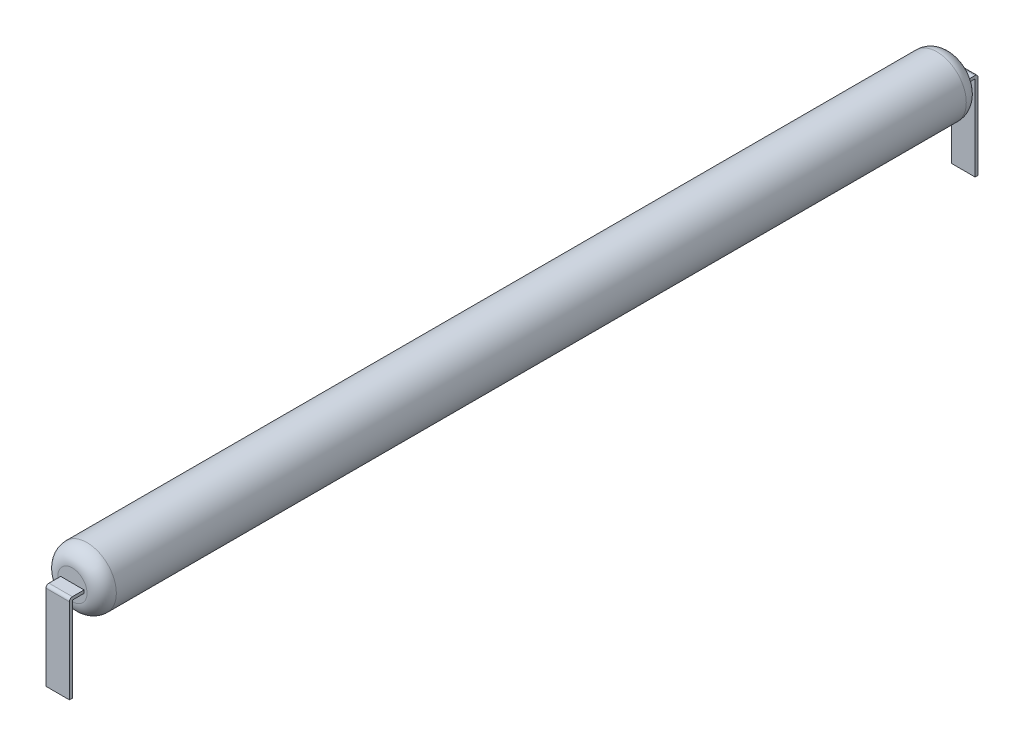
ISO-10303-21;
HEADER;
FILE_DESCRIPTION(('STEP AP214'),'2;1');
FILE_NAME('part.step','',(''),(''),'','','');
FILE_SCHEMA(('AUTOMOTIVE_DESIGN { 1 0 10303 214 1 1 1 1 }'));
ENDSEC;
DATA;
#1=APPLICATION_CONTEXT('core data for automotive mechanical design processes');
#2=APPLICATION_PROTOCOL_DEFINITION('international standard','automotive_design',2000,#1);
#3=PRODUCT_CONTEXT('',#1,'mechanical');
#4=PRODUCT('Part','Part','',(#3));
#5=PRODUCT_RELATED_PRODUCT_CATEGORY('part','',(#4));
#6=PRODUCT_DEFINITION_FORMATION('','',#4);
#7=PRODUCT_DEFINITION_CONTEXT('part definition',#1,'design');
#8=PRODUCT_DEFINITION('design','',#6,#7);
#9=PRODUCT_DEFINITION_SHAPE('','',#8);
#10=(LENGTH_UNIT() NAMED_UNIT(*) SI_UNIT(.MILLI.,.METRE.));
#11=(NAMED_UNIT(*) PLANE_ANGLE_UNIT() SI_UNIT($,.RADIAN.));
#12=(NAMED_UNIT(*) SI_UNIT($,.STERADIAN.) SOLID_ANGLE_UNIT());
#13=UNCERTAINTY_MEASURE_WITH_UNIT(LENGTH_MEASURE(1.E-05),#10,'distance_accuracy_value','');
#14=(GEOMETRIC_REPRESENTATION_CONTEXT(3) GLOBAL_UNCERTAINTY_ASSIGNED_CONTEXT((#13)) GLOBAL_UNIT_ASSIGNED_CONTEXT((#10,
#11,#12)) REPRESENTATION_CONTEXT('',''));
#15=CARTESIAN_POINT('',(0.,0.,0.));
#16=DIRECTION('',(0.,0.,1.));
#17=DIRECTION('',(1.,0.,0.));
#18=AXIS2_PLACEMENT_3D('',#15,#16,#17);
#19=CARTESIAN_POINT('',(0.4,-0.05,-16.));
#20=DIRECTION('',(0.,1.,0.));
#21=DIRECTION('',(0.,0.,1.));
#22=AXIS2_PLACEMENT_3D('',#19,#20,#21);
#23=PLANE('',#22);
#24=DIRECTION('',(0.,0.,1.));
#25=VECTOR('',#24,1.);
#26=CARTESIAN_POINT('',(-0.4,-0.05,-16.));
#27=LINE('',#26,#25);
#28=CARTESIAN_POINT('',(-0.4,-0.05,-15.4));
#29=VERTEX_POINT('',#28);
#30=CARTESIAN_POINT('',(-0.4,-0.05,-15.));
#31=VERTEX_POINT('',#30);
#32=EDGE_CURVE('E252',#29,#31,#27,.T.);
#33=ORIENTED_EDGE('',*,*,#32,.F.);
#34=DIRECTION('',(1.,0.,0.));
#35=VECTOR('',#34,1.);
#36=CARTESIAN_POINT('',(0.4,-0.05,-15.4));
#37=LINE('',#36,#35);
#38=CARTESIAN_POINT('',(0.4,-0.0500000000000001,-15.4));
#39=VERTEX_POINT('',#38);
#40=EDGE_CURVE('E308',#29,#39,#37,.T.);
#41=ORIENTED_EDGE('',*,*,#40,.T.);
#42=DIRECTION('',(0.,0.,1.));
#43=VECTOR('',#42,1.);
#44=CARTESIAN_POINT('',(0.4,-0.05,-16.));
#45=LINE('',#44,#43);
#46=CARTESIAN_POINT('',(0.4,-0.05,-15.));
#47=VERTEX_POINT('',#46);
#48=EDGE_CURVE('E255',#39,#47,#45,.T.);
#49=ORIENTED_EDGE('',*,*,#48,.T.);
#50=DIRECTION('',(-1.,0.,0.));
#51=VECTOR('',#50,1.);
#52=CARTESIAN_POINT('',(0.4,-0.05,-15.));
#53=LINE('',#52,#51);
#54=EDGE_CURVE('E248',#47,#31,#53,.T.);
#55=ORIENTED_EDGE('',*,*,#54,.T.);
#56=EDGE_LOOP('',(#33,#41,#49,#55));
#57=FACE_BOUND('',#56,.T.);
#58=ADVANCED_FACE('F40',(#57),#23,.F.);
#59=CARTESIAN_POINT('',(0.,0.,-15.));
#60=DIRECTION('',(0.,0.,1.));
#61=DIRECTION('',(1.,0.,0.));
#62=AXIS2_PLACEMENT_3D('',#59,#60,#61);
#63=PLANE('',#62);
#64=CARTESIAN_POINT('',(0.,0.,-15.));
#65=DIRECTION('',(0.,0.,1.));
#66=DIRECTION('',(1.,0.,0.));
#67=AXIS2_PLACEMENT_3D('',#64,#65,#66);
#68=CIRCLE('',#67,0.5);
#69=CARTESIAN_POINT('',(0.5,0.,-15.));
#70=VERTEX_POINT('',#69);
#71=EDGE_CURVE('E304',#70,#70,#68,.F.);
#72=ORIENTED_EDGE('',*,*,#71,.T.);
#73=EDGE_LOOP('',(#72));
#74=FACE_BOUND('',#73,.T.);
#75=DIRECTION('',(0.,1.,0.));
#76=VECTOR('',#75,1.);
#77=CARTESIAN_POINT('',(-0.4,-0.05,-15.));
#78=LINE('',#77,#76);
#79=CARTESIAN_POINT('',(-0.4,0.05,-15.));
#80=VERTEX_POINT('',#79);
#81=EDGE_CURVE('E233',#31,#80,#78,.T.);
#82=ORIENTED_EDGE('',*,*,#81,.F.);
#83=ORIENTED_EDGE('',*,*,#54,.F.);
#84=DIRECTION('',(0.,-1.,0.));
#85=VECTOR('',#84,1.);
#86=CARTESIAN_POINT('',(0.4,-0.05,-15.));
#87=LINE('',#86,#85);
#88=CARTESIAN_POINT('',(0.4,0.05,-15.));
#89=VERTEX_POINT('',#88);
#90=EDGE_CURVE('E244',#89,#47,#87,.T.);
#91=ORIENTED_EDGE('',*,*,#90,.F.);
#92=DIRECTION('',(1.,0.,0.));
#93=VECTOR('',#92,1.);
#94=CARTESIAN_POINT('',(0.4,0.05,-15.));
#95=LINE('',#94,#93);
#96=EDGE_CURVE('E240',#80,#89,#95,.T.);
#97=ORIENTED_EDGE('',*,*,#96,.F.);
#98=EDGE_LOOP('',(#82,#83,#91,#97));
#99=FACE_BOUND('',#98,.T.);
#100=ADVANCED_FACE('F355',(#74,#99),#63,.F.);
#101=CARTESIAN_POINT('',(0.,0.,15.));
#102=DIRECTION('',(0.,0.,1.));
#103=DIRECTION('',(1.,0.,0.));
#104=AXIS2_PLACEMENT_3D('',#101,#102,#103);
#105=PLANE('',#104);
#106=CARTESIAN_POINT('',(0.,0.,15.));
#107=DIRECTION('',(0.,0.,1.));
#108=DIRECTION('',(1.,0.,0.));
#109=AXIS2_PLACEMENT_3D('',#106,#107,#108);
#110=CIRCLE('',#109,0.5);
#111=CARTESIAN_POINT('',(0.5,0.,15.));
#112=VERTEX_POINT('',#111);
#113=EDGE_CURVE('E292',#112,#112,#110,.T.);
#114=ORIENTED_EDGE('',*,*,#113,.T.);
#115=EDGE_LOOP('',(#114));
#116=FACE_BOUND('',#115,.T.);
#117=DIRECTION('',(-1.,0.,0.));
#118=VECTOR('',#117,1.);
#119=CARTESIAN_POINT('',(-0.4,0.05,15.));
#120=LINE('',#119,#118);
#121=CARTESIAN_POINT('',(0.4,0.05,15.));
#122=VERTEX_POINT('',#121);
#123=CARTESIAN_POINT('',(-0.4,0.05,15.));
#124=VERTEX_POINT('',#123);
#125=EDGE_CURVE('E268',#122,#124,#120,.T.);
#126=ORIENTED_EDGE('',*,*,#125,.F.);
#127=DIRECTION('',(0.,1.,0.));
#128=VECTOR('',#127,1.);
#129=CARTESIAN_POINT('',(0.4,-0.05,15.));
#130=LINE('',#129,#128);
#131=CARTESIAN_POINT('',(0.4,-0.05,15.));
#132=VERTEX_POINT('',#131);
#133=EDGE_CURVE('E264',#132,#122,#130,.T.);
#134=ORIENTED_EDGE('',*,*,#133,.F.);
#135=DIRECTION('',(1.,0.,0.));
#136=VECTOR('',#135,1.);
#137=CARTESIAN_POINT('',(-0.4,-0.05,15.));
#138=LINE('',#137,#136);
#139=CARTESIAN_POINT('',(-0.4,-0.05,15.));
#140=VERTEX_POINT('',#139);
#141=EDGE_CURVE('E276',#140,#132,#138,.T.);
#142=ORIENTED_EDGE('',*,*,#141,.F.);
#143=DIRECTION('',(0.,-1.,0.));
#144=VECTOR('',#143,1.);
#145=CARTESIAN_POINT('',(-0.4,-0.05,15.));
#146=LINE('',#145,#144);
#147=EDGE_CURVE('E272',#124,#140,#146,.T.);
#148=ORIENTED_EDGE('',*,*,#147,.F.);
#149=EDGE_LOOP('',(#126,#134,#142,#148));
#150=FACE_BOUND('',#149,.T.);
#151=ADVANCED_FACE('F347',(#116,#150),#105,.T.);
#152=CARTESIAN_POINT('',(0.,0.,-15.));
#153=DIRECTION('',(0.,0.,1.));
#154=DIRECTION('',(1.,0.,0.));
#155=AXIS2_PLACEMENT_3D('',#152,#153,#154);
#156=CYLINDRICAL_SURFACE('',#155,1.);
#157=CARTESIAN_POINT('',(0.,0.,14.5));
#158=DIRECTION('',(0.,0.,1.));
#159=DIRECTION('',(1.,0.,0.));
#160=AXIS2_PLACEMENT_3D('',#157,#158,#159);
#161=CIRCLE('',#160,1.);
#162=CARTESIAN_POINT('',(1.,0.,14.5));
#163=VERTEX_POINT('',#162);
#164=EDGE_CURVE('E300',#163,#163,#161,.F.);
#165=ORIENTED_EDGE('',*,*,#164,.T.);
#166=EDGE_LOOP('',(#165));
#167=FACE_BOUND('',#166,.T.);
#168=CARTESIAN_POINT('',(0.,0.,-14.5));
#169=DIRECTION('',(0.,0.,1.));
#170=DIRECTION('',(1.,0.,0.));
#171=AXIS2_PLACEMENT_3D('',#168,#169,#170);
#172=CIRCLE('',#171,1.);
#173=CARTESIAN_POINT('',(1.,0.,-14.5));
#174=VERTEX_POINT('',#173);
#175=EDGE_CURVE('E296',#174,#174,#172,.T.);
#176=ORIENTED_EDGE('',*,*,#175,.T.);
#177=EDGE_LOOP('',(#176));
#178=FACE_BOUND('',#177,.T.);
#179=ADVANCED_FACE('F389',(#167,#178),#156,.T.);
#180=CARTESIAN_POINT('',(0.4,-0.05,16.));
#181=DIRECTION('',(-1.,0.,0.));
#182=DIRECTION('',(0.,0.,1.));
#183=AXIS2_PLACEMENT_3D('',#180,#181,#182);
#184=PLANE('',#183);
#185=DIRECTION('',(0.,0.,-1.));
#186=VECTOR('',#185,1.);
#187=CARTESIAN_POINT('',(0.4,0.05,16.));
#188=LINE('',#187,#186);
#189=CARTESIAN_POINT('',(0.4,0.05,15.4));
#190=VERTEX_POINT('',#189);
#191=EDGE_CURVE('E289',#190,#122,#188,.T.);
#192=ORIENTED_EDGE('',*,*,#191,.F.);
#193=CARTESIAN_POINT('',(0.4,-0.0500000000000001,15.4));
#194=DIRECTION('',(-1.,0.,0.));
#195=DIRECTION('',(0.,0.,1.));
#196=AXIS2_PLACEMENT_3D('',#193,#194,#195);
#197=CIRCLE('',#196,0.1);
#198=CARTESIAN_POINT('',(0.4,-0.0500000000000001,15.5));
#199=VERTEX_POINT('',#198);
#200=EDGE_CURVE('E11',#190,#199,#197,.F.);
#201=ORIENTED_EDGE('',*,*,#200,.T.);
#202=DIRECTION('',(0.,1.,0.));
#203=VECTOR('',#202,1.);
#204=CARTESIAN_POINT('',(0.4,-2.95,15.5));
#205=LINE('',#204,#203);
#206=CARTESIAN_POINT('',(0.4,-2.95,15.5));
#207=VERTEX_POINT('',#206);
#208=EDGE_CURVE('E191',#207,#199,#205,.T.);
#209=ORIENTED_EDGE('',*,*,#208,.F.);
#210=DIRECTION('',(0.,0.,1.));
#211=VECTOR('',#210,1.);
#212=CARTESIAN_POINT('',(0.4,-2.95,15.5));
#213=LINE('',#212,#211);
#214=CARTESIAN_POINT('',(0.4,-2.95,15.4));
#215=VERTEX_POINT('',#214);
#216=EDGE_CURVE('E180',#215,#207,#213,.T.);
#217=ORIENTED_EDGE('',*,*,#216,.F.);
#218=DIRECTION('',(0.,-1.,0.));
#219=VECTOR('',#218,1.);
#220=CARTESIAN_POINT('',(0.4,-2.95,15.4));
#221=LINE('',#220,#219);
#222=CARTESIAN_POINT('',(0.4,-0.05,15.4));
#223=VERTEX_POINT('',#222);
#224=EDGE_CURVE('E169',#223,#215,#221,.T.);
#225=ORIENTED_EDGE('',*,*,#224,.F.);
#226=DIRECTION('',(0.,0.,-1.));
#227=VECTOR('',#226,1.);
#228=CARTESIAN_POINT('',(0.4,-0.05,16.));
#229=LINE('',#228,#227);
#230=EDGE_CURVE('E280',#223,#132,#229,.T.);
#231=ORIENTED_EDGE('',*,*,#230,.T.);
#232=ORIENTED_EDGE('',*,*,#133,.T.);
#233=EDGE_LOOP('',(#192,#201,#209,#217,#225,#231,#232));
#234=FACE_BOUND('',#233,.T.);
#235=ADVANCED_FACE('F193',(#234),#184,.F.);
#236=CARTESIAN_POINT('',(-0.4,0.05,16.));
#237=DIRECTION('',(0.,-1.,0.));
#238=DIRECTION('',(0.,0.,-1.));
#239=AXIS2_PLACEMENT_3D('',#236,#237,#238);
#240=PLANE('',#239);
#241=DIRECTION('',(0.,0.,-1.));
#242=VECTOR('',#241,1.);
#243=CARTESIAN_POINT('',(-0.4,0.05,16.));
#244=LINE('',#243,#242);
#245=CARTESIAN_POINT('',(-0.4,0.05,15.4));
#246=VERTEX_POINT('',#245);
#247=EDGE_CURVE('E286',#246,#124,#244,.T.);
#248=ORIENTED_EDGE('',*,*,#247,.F.);
#249=DIRECTION('',(-1.,0.,0.));
#250=VECTOR('',#249,1.);
#251=CARTESIAN_POINT('',(0.4,0.05,15.4));
#252=LINE('',#251,#250);
#253=EDGE_CURVE('E49',#246,#190,#252,.F.);
#254=ORIENTED_EDGE('',*,*,#253,.T.);
#255=ORIENTED_EDGE('',*,*,#191,.T.);
#256=ORIENTED_EDGE('',*,*,#125,.T.);
#257=EDGE_LOOP('',(#248,#254,#255,#256));
#258=FACE_BOUND('',#257,.T.);
#259=ADVANCED_FACE('F348',(#258),#240,.F.);
#260=CARTESIAN_POINT('',(-0.4,-0.05,16.));
#261=DIRECTION('',(1.,0.,0.));
#262=DIRECTION('',(0.,0.,-1.));
#263=AXIS2_PLACEMENT_3D('',#260,#261,#262);
#264=PLANE('',#263);
#265=DIRECTION('',(0.,1.,0.));
#266=VECTOR('',#265,1.);
#267=CARTESIAN_POINT('',(-0.4,-2.95,15.5));
#268=LINE('',#267,#266);
#269=CARTESIAN_POINT('',(-0.4,-2.95,15.5));
#270=VERTEX_POINT('',#269);
#271=CARTESIAN_POINT('',(-0.4,-0.0500000000000001,15.5));
#272=VERTEX_POINT('',#271);
#273=EDGE_CURVE('E181',#270,#272,#268,.T.);
#274=ORIENTED_EDGE('',*,*,#273,.T.);
#275=CARTESIAN_POINT('',(-0.4,-0.0500000000000001,15.4));
#276=DIRECTION('',(1.,0.,0.));
#277=DIRECTION('',(0.,0.,-1.));
#278=AXIS2_PLACEMENT_3D('',#275,#276,#277);
#279=CIRCLE('',#278,0.1);
#280=EDGE_CURVE('E69',#272,#246,#279,.F.);
#281=ORIENTED_EDGE('',*,*,#280,.T.);
#282=ORIENTED_EDGE('',*,*,#247,.T.);
#283=ORIENTED_EDGE('',*,*,#147,.T.);
#284=DIRECTION('',(0.,0.,-1.));
#285=VECTOR('',#284,1.);
#286=CARTESIAN_POINT('',(-0.4,-0.05,16.));
#287=LINE('',#286,#285);
#288=CARTESIAN_POINT('',(-0.4,-0.0500000000000001,15.4));
#289=VERTEX_POINT('',#288);
#290=EDGE_CURVE('E283',#289,#140,#287,.T.);
#291=ORIENTED_EDGE('',*,*,#290,.F.);
#292=DIRECTION('',(0.,-1.,0.));
#293=VECTOR('',#292,1.);
#294=CARTESIAN_POINT('',(-0.4,-2.95,15.4));
#295=LINE('',#294,#293);
#296=CARTESIAN_POINT('',(-0.4,-2.95,15.4));
#297=VERTEX_POINT('',#296);
#298=EDGE_CURVE('E201',#289,#297,#295,.T.);
#299=ORIENTED_EDGE('',*,*,#298,.T.);
#300=DIRECTION('',(0.,0.,1.));
#301=VECTOR('',#300,1.);
#302=CARTESIAN_POINT('',(-0.4,-2.95,15.5));
#303=LINE('',#302,#301);
#304=EDGE_CURVE('E188',#297,#270,#303,.T.);
#305=ORIENTED_EDGE('',*,*,#304,.T.);
#306=EDGE_LOOP('',(#274,#281,#282,#283,#291,#299,#305));
#307=FACE_BOUND('',#306,.T.);
#308=ADVANCED_FACE('F339',(#307),#264,.F.);
#309=CARTESIAN_POINT('',(-0.4,-0.05,16.));
#310=DIRECTION('',(0.,1.,0.));
#311=DIRECTION('',(0.,0.,1.));
#312=AXIS2_PLACEMENT_3D('',#309,#310,#311);
#313=PLANE('',#312);
#314=ORIENTED_EDGE('',*,*,#230,.F.);
#315=DIRECTION('',(-1.,0.,0.));
#316=VECTOR('',#315,1.);
#317=CARTESIAN_POINT('',(-0.4,-0.05,15.4));
#318=LINE('',#317,#316);
#319=EDGE_CURVE('E176',#223,#289,#318,.T.);
#320=ORIENTED_EDGE('',*,*,#319,.T.);
#321=ORIENTED_EDGE('',*,*,#290,.T.);
#322=ORIENTED_EDGE('',*,*,#141,.T.);
#323=EDGE_LOOP('',(#314,#320,#321,#322));
#324=FACE_BOUND('',#323,.T.);
#325=ADVANCED_FACE('F343',(#324),#313,.F.);
#326=CARTESIAN_POINT('',(-0.4,-0.05,-16.));
#327=DIRECTION('',(1.,0.,0.));
#328=DIRECTION('',(0.,0.,-1.));
#329=AXIS2_PLACEMENT_3D('',#326,#327,#328);
#330=PLANE('',#329);
#331=DIRECTION('',(0.,0.,1.));
#332=VECTOR('',#331,1.);
#333=CARTESIAN_POINT('',(-0.4,0.05,-16.));
#334=LINE('',#333,#332);
#335=CARTESIAN_POINT('',(-0.4,0.05,-15.4));
#336=VERTEX_POINT('',#335);
#337=EDGE_CURVE('E261',#336,#80,#334,.T.);
#338=ORIENTED_EDGE('',*,*,#337,.F.);
#339=CARTESIAN_POINT('',(-0.4,-0.05,-15.4));
#340=DIRECTION('',(1.,0.,0.));
#341=DIRECTION('',(0.,0.,-1.));
#342=AXIS2_PLACEMENT_3D('',#339,#340,#341);
#343=CIRCLE('',#342,0.1);
#344=CARTESIAN_POINT('',(-0.4,-0.0500000000000001,-15.5));
#345=VERTEX_POINT('',#344);
#346=EDGE_CURVE('E316',#336,#345,#343,.F.);
#347=ORIENTED_EDGE('',*,*,#346,.T.);
#348=DIRECTION('',(0.,-1.,0.));
#349=VECTOR('',#348,1.);
#350=CARTESIAN_POINT('',(-0.4,-2.95,-15.5));
#351=LINE('',#350,#349);
#352=CARTESIAN_POINT('',(-0.4,-2.95,-15.5));
#353=VERTEX_POINT('',#352);
#354=EDGE_CURVE('E208',#345,#353,#351,.T.);
#355=ORIENTED_EDGE('',*,*,#354,.T.);
#356=DIRECTION('',(0.,0.,1.));
#357=VECTOR('',#356,1.);
#358=CARTESIAN_POINT('',(-0.4,-2.95,-15.5));
#359=LINE('',#358,#357);
#360=CARTESIAN_POINT('',(-0.4,-2.95,-15.4));
#361=VERTEX_POINT('',#360);
#362=EDGE_CURVE('E224',#353,#361,#359,.T.);
#363=ORIENTED_EDGE('',*,*,#362,.T.);
#364=DIRECTION('',(0.,1.,0.));
#365=VECTOR('',#364,1.);
#366=CARTESIAN_POINT('',(-0.4,-2.95,-15.4));
#367=LINE('',#366,#365);
#368=EDGE_CURVE('E214',#361,#29,#367,.T.);
#369=ORIENTED_EDGE('',*,*,#368,.T.);
#370=ORIENTED_EDGE('',*,*,#32,.T.);
#371=ORIENTED_EDGE('',*,*,#81,.T.);
#372=EDGE_LOOP('',(#338,#347,#355,#363,#369,#370,#371));
#373=FACE_BOUND('',#372,.T.);
#374=ADVANCED_FACE('F376',(#373),#330,.F.);
#375=CARTESIAN_POINT('',(0.4,0.05,-16.));
#376=DIRECTION('',(0.,-1.,0.));
#377=DIRECTION('',(0.,0.,-1.));
#378=AXIS2_PLACEMENT_3D('',#375,#376,#377);
#379=PLANE('',#378);
#380=DIRECTION('',(0.,0.,1.));
#381=VECTOR('',#380,1.);
#382=CARTESIAN_POINT('',(0.4,0.05,-16.));
#383=LINE('',#382,#381);
#384=CARTESIAN_POINT('',(0.4,0.05,-15.4));
#385=VERTEX_POINT('',#384);
#386=EDGE_CURVE('E258',#385,#89,#383,.T.);
#387=ORIENTED_EDGE('',*,*,#386,.F.);
#388=DIRECTION('',(-1.,0.,0.));
#389=VECTOR('',#388,1.);
#390=CARTESIAN_POINT('',(-0.4,0.05,-15.4));
#391=LINE('',#390,#389);
#392=EDGE_CURVE('E312',#385,#336,#391,.T.);
#393=ORIENTED_EDGE('',*,*,#392,.T.);
#394=ORIENTED_EDGE('',*,*,#337,.T.);
#395=ORIENTED_EDGE('',*,*,#96,.T.);
#396=EDGE_LOOP('',(#387,#393,#394,#395));
#397=FACE_BOUND('',#396,.T.);
#398=ADVANCED_FACE('F372',(#397),#379,.F.);
#399=CARTESIAN_POINT('',(0.4,-0.05,-16.));
#400=DIRECTION('',(-1.,0.,0.));
#401=DIRECTION('',(0.,0.,1.));
#402=AXIS2_PLACEMENT_3D('',#399,#400,#401);
#403=PLANE('',#402);
#404=DIRECTION('',(0.,-1.,0.));
#405=VECTOR('',#404,1.);
#406=CARTESIAN_POINT('',(0.4,-2.95,-15.5));
#407=LINE('',#406,#405);
#408=CARTESIAN_POINT('',(0.4,-0.0500000000000001,-15.5));
#409=VERTEX_POINT('',#408);
#410=CARTESIAN_POINT('',(0.4,-2.95,-15.5));
#411=VERTEX_POINT('',#410);
#412=EDGE_CURVE('E210',#409,#411,#407,.T.);
#413=ORIENTED_EDGE('',*,*,#412,.F.);
#414=CARTESIAN_POINT('',(0.4,-0.05,-15.4));
#415=DIRECTION('',(-1.,0.,0.));
#416=DIRECTION('',(0.,0.,1.));
#417=AXIS2_PLACEMENT_3D('',#414,#415,#416);
#418=CIRCLE('',#417,0.1);
#419=EDGE_CURVE('E322',#409,#385,#418,.F.);
#420=ORIENTED_EDGE('',*,*,#419,.T.);
#421=ORIENTED_EDGE('',*,*,#386,.T.);
#422=ORIENTED_EDGE('',*,*,#90,.T.);
#423=ORIENTED_EDGE('',*,*,#48,.F.);
#424=DIRECTION('',(0.,1.,0.));
#425=VECTOR('',#424,1.);
#426=CARTESIAN_POINT('',(0.4,-2.95,-15.4));
#427=LINE('',#426,#425);
#428=CARTESIAN_POINT('',(0.4,-2.95,-15.4));
#429=VERTEX_POINT('',#428);
#430=EDGE_CURVE('E218',#429,#39,#427,.T.);
#431=ORIENTED_EDGE('',*,*,#430,.F.);
#432=DIRECTION('',(0.,0.,1.));
#433=VECTOR('',#432,1.);
#434=CARTESIAN_POINT('',(0.4,-2.95,-15.5));
#435=LINE('',#434,#433);
#436=EDGE_CURVE('E213',#411,#429,#435,.T.);
#437=ORIENTED_EDGE('',*,*,#436,.F.);
#438=EDGE_LOOP('',(#413,#420,#421,#422,#423,#431,#437));
#439=FACE_BOUND('',#438,.T.);
#440=ADVANCED_FACE('F368',(#439),#403,.F.);
#441=CARTESIAN_POINT('',(0.,0.,14.5));
#442=DIRECTION('',(0.,0.,1.));
#443=DIRECTION('',(1.,0.,0.));
#444=AXIS2_PLACEMENT_3D('',#441,#442,#443);
#445=DEGENERATE_TOROIDAL_SURFACE('',#444,0.5,0.5,.T.);
#446=ORIENTED_EDGE('',*,*,#164,.F.);
#447=EDGE_LOOP('',(#446));
#448=FACE_BOUND('',#447,.T.);
#449=ORIENTED_EDGE('',*,*,#113,.F.);
#450=EDGE_LOOP('',(#449));
#451=FACE_BOUND('',#450,.T.);
#452=ADVANCED_FACE('F371',(#448,#451),#445,.T.);
#453=CARTESIAN_POINT('',(0.,0.,-14.5));
#454=DIRECTION('',(0.,0.,1.));
#455=DIRECTION('',(1.,0.,0.));
#456=AXIS2_PLACEMENT_3D('',#453,#454,#455);
#457=DEGENERATE_TOROIDAL_SURFACE('',#456,0.5,0.5,.T.);
#458=ORIENTED_EDGE('',*,*,#71,.F.);
#459=EDGE_LOOP('',(#458));
#460=FACE_BOUND('',#459,.T.);
#461=ORIENTED_EDGE('',*,*,#175,.F.);
#462=EDGE_LOOP('',(#461));
#463=FACE_BOUND('',#462,.T.);
#464=ADVANCED_FACE('F398',(#460,#463),#457,.T.);
#465=CARTESIAN_POINT('',(0.4,-2.95,-15.4));
#466=DIRECTION('',(0.,0.,1.));
#467=DIRECTION('',(1.,0.,0.));
#468=AXIS2_PLACEMENT_3D('',#465,#466,#467);
#469=PLANE('',#468);
#470=ORIENTED_EDGE('',*,*,#40,.F.);
#471=ORIENTED_EDGE('',*,*,#368,.F.);
#472=DIRECTION('',(-1.,0.,0.));
#473=VECTOR('',#472,1.);
#474=CARTESIAN_POINT('',(0.4,-2.95,-15.4));
#475=LINE('',#474,#473);
#476=EDGE_CURVE('E230',#429,#361,#475,.T.);
#477=ORIENTED_EDGE('',*,*,#476,.F.);
#478=ORIENTED_EDGE('',*,*,#430,.T.);
#479=EDGE_LOOP('',(#470,#471,#477,#478));
#480=FACE_BOUND('',#479,.T.);
#481=ADVANCED_FACE('F401',(#480),#469,.T.);
#482=CARTESIAN_POINT('',(0.4,-2.95,-15.5));
#483=DIRECTION('',(0.,0.,-1.));
#484=DIRECTION('',(-1.,0.,0.));
#485=AXIS2_PLACEMENT_3D('',#482,#483,#484);
#486=PLANE('',#485);
#487=ORIENTED_EDGE('',*,*,#354,.F.);
#488=DIRECTION('',(-1.,0.,0.));
#489=VECTOR('',#488,1.);
#490=CARTESIAN_POINT('',(0.4,-0.05,-15.5));
#491=LINE('',#490,#489);
#492=EDGE_CURVE('E319',#345,#409,#491,.F.);
#493=ORIENTED_EDGE('',*,*,#492,.T.);
#494=ORIENTED_EDGE('',*,*,#412,.T.);
#495=DIRECTION('',(-1.,0.,0.));
#496=VECTOR('',#495,1.);
#497=CARTESIAN_POINT('',(0.4,-2.95,-15.5));
#498=LINE('',#497,#496);
#499=EDGE_CURVE('E221',#411,#353,#498,.T.);
#500=ORIENTED_EDGE('',*,*,#499,.T.);
#501=EDGE_LOOP('',(#487,#493,#494,#500));
#502=FACE_BOUND('',#501,.T.);
#503=ADVANCED_FACE('F366',(#502),#486,.T.);
#504=CARTESIAN_POINT('',(0.4,-2.95,-15.5));
#505=DIRECTION('',(0.,-1.,0.));
#506=DIRECTION('',(0.,0.,-1.));
#507=AXIS2_PLACEMENT_3D('',#504,#505,#506);
#508=PLANE('',#507);
#509=ORIENTED_EDGE('',*,*,#362,.F.);
#510=ORIENTED_EDGE('',*,*,#499,.F.);
#511=ORIENTED_EDGE('',*,*,#436,.T.);
#512=ORIENTED_EDGE('',*,*,#476,.T.);
#513=EDGE_LOOP('',(#509,#510,#511,#512));
#514=FACE_BOUND('',#513,.T.);
#515=ADVANCED_FACE('F405',(#514),#508,.T.);
#516=CARTESIAN_POINT('',(0.4,-0.05,-15.4));
#517=DIRECTION('',(1.,0.,0.));
#518=DIRECTION('',(0.,0.,-1.));
#519=AXIS2_PLACEMENT_3D('',#516,#517,#518);
#520=CYLINDRICAL_SURFACE('',#519,0.1);
#521=ORIENTED_EDGE('',*,*,#419,.F.);
#522=ORIENTED_EDGE('',*,*,#492,.F.);
#523=ORIENTED_EDGE('',*,*,#346,.F.);
#524=ORIENTED_EDGE('',*,*,#392,.F.);
#525=EDGE_LOOP('',(#521,#522,#523,#524));
#526=FACE_BOUND('',#525,.T.);
#527=ADVANCED_FACE('F403',(#526),#520,.T.);
#528=CARTESIAN_POINT('',(0.4,-2.95,15.5));
#529=DIRECTION('',(0.,0.,1.));
#530=DIRECTION('',(1.,0.,0.));
#531=AXIS2_PLACEMENT_3D('',#528,#529,#530);
#532=PLANE('',#531);
#533=ORIENTED_EDGE('',*,*,#208,.T.);
#534=DIRECTION('',(-1.,0.,0.));
#535=VECTOR('',#534,1.);
#536=CARTESIAN_POINT('',(-0.4,-0.0500000000000001,15.5));
#537=LINE('',#536,#535);
#538=EDGE_CURVE('E327',#199,#272,#537,.T.);
#539=ORIENTED_EDGE('',*,*,#538,.T.);
#540=ORIENTED_EDGE('',*,*,#273,.F.);
#541=DIRECTION('',(-1.,0.,0.));
#542=VECTOR('',#541,1.);
#543=CARTESIAN_POINT('',(0.4,-2.95,15.5));
#544=LINE('',#543,#542);
#545=EDGE_CURVE('E190',#207,#270,#544,.T.);
#546=ORIENTED_EDGE('',*,*,#545,.F.);
#547=EDGE_LOOP('',(#533,#539,#540,#546));
#548=FACE_BOUND('',#547,.T.);
#549=ADVANCED_FACE('F336',(#548),#532,.T.);
#550=CARTESIAN_POINT('',(0.4,-2.95,15.4));
#551=DIRECTION('',(0.,0.,-1.));
#552=DIRECTION('',(-1.,0.,0.));
#553=AXIS2_PLACEMENT_3D('',#550,#551,#552);
#554=PLANE('',#553);
#555=ORIENTED_EDGE('',*,*,#319,.F.);
#556=ORIENTED_EDGE('',*,*,#224,.T.);
#557=DIRECTION('',(-1.,0.,0.));
#558=VECTOR('',#557,1.);
#559=CARTESIAN_POINT('',(0.4,-2.95,15.4));
#560=LINE('',#559,#558);
#561=EDGE_CURVE('E173',#215,#297,#560,.T.);
#562=ORIENTED_EDGE('',*,*,#561,.T.);
#563=ORIENTED_EDGE('',*,*,#298,.F.);
#564=EDGE_LOOP('',(#555,#556,#562,#563));
#565=FACE_BOUND('',#564,.T.);
#566=ADVANCED_FACE('F171',(#565),#554,.T.);
#567=CARTESIAN_POINT('',(0.4,-2.95,15.5));
#568=DIRECTION('',(0.,-1.,0.));
#569=DIRECTION('',(0.,0.,-1.));
#570=AXIS2_PLACEMENT_3D('',#567,#568,#569);
#571=PLANE('',#570);
#572=ORIENTED_EDGE('',*,*,#304,.F.);
#573=ORIENTED_EDGE('',*,*,#561,.F.);
#574=ORIENTED_EDGE('',*,*,#216,.T.);
#575=ORIENTED_EDGE('',*,*,#545,.T.);
#576=EDGE_LOOP('',(#572,#573,#574,#575));
#577=FACE_BOUND('',#576,.T.);
#578=ADVANCED_FACE('F185',(#577),#571,.T.);
#579=CARTESIAN_POINT('',(0.4,-0.0500000000000001,15.4));
#580=DIRECTION('',(1.,0.,0.));
#581=DIRECTION('',(0.,0.,-1.));
#582=AXIS2_PLACEMENT_3D('',#579,#580,#581);
#583=CYLINDRICAL_SURFACE('',#582,0.1);
#584=ORIENTED_EDGE('',*,*,#200,.F.);
#585=ORIENTED_EDGE('',*,*,#253,.F.);
#586=ORIENTED_EDGE('',*,*,#280,.F.);
#587=ORIENTED_EDGE('',*,*,#538,.F.);
#588=EDGE_LOOP('',(#584,#585,#586,#587));
#589=FACE_BOUND('',#588,.T.);
#590=ADVANCED_FACE('F42',(#589),#583,.T.);
#591=CLOSED_SHELL('',(#58,#100,#151,#179,#235,#259,#308,#325,#374,#398,#440,#452,#464,#481,#503,
#515,#527,#549,#566,#578,#590));
#592=MANIFOLD_SOLID_BREP('B2',#591);
#593=ADVANCED_BREP_SHAPE_REPRESENTATION('',(#18,#592),#14);
#594=SHAPE_DEFINITION_REPRESENTATION(#9,#593);
ENDSEC;
END-ISO-10303-21;
